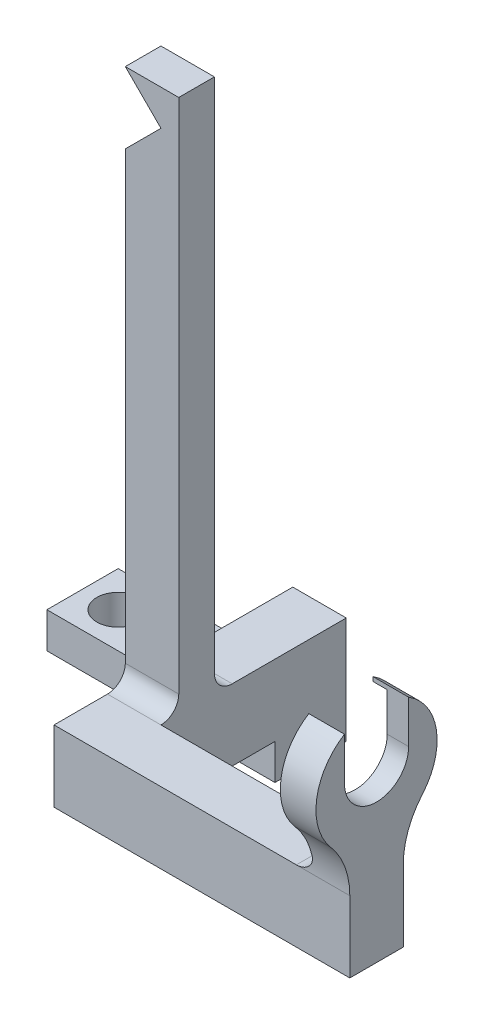
ISO-10303-21;
HEADER;
FILE_DESCRIPTION(('STEP AP214'),'2;1');
FILE_NAME('part.step','',(''),(''),'','','');
FILE_SCHEMA(('AUTOMOTIVE_DESIGN { 1 0 10303 214 1 1 1 1 }'));
ENDSEC;
DATA;
#1=APPLICATION_CONTEXT('core data for automotive mechanical design processes');
#2=APPLICATION_PROTOCOL_DEFINITION('international standard','automotive_design',2000,#1);
#3=PRODUCT_CONTEXT('',#1,'mechanical');
#4=PRODUCT('Part','Part','',(#3));
#5=PRODUCT_RELATED_PRODUCT_CATEGORY('part','',(#4));
#6=PRODUCT_DEFINITION_FORMATION('','',#4);
#7=PRODUCT_DEFINITION_CONTEXT('part definition',#1,'design');
#8=PRODUCT_DEFINITION('design','',#6,#7);
#9=PRODUCT_DEFINITION_SHAPE('','',#8);
#10=(LENGTH_UNIT() NAMED_UNIT(*) SI_UNIT(.MILLI.,.METRE.));
#11=(NAMED_UNIT(*) PLANE_ANGLE_UNIT() SI_UNIT($,.RADIAN.));
#12=(NAMED_UNIT(*) SI_UNIT($,.STERADIAN.) SOLID_ANGLE_UNIT());
#13=UNCERTAINTY_MEASURE_WITH_UNIT(LENGTH_MEASURE(1.E-05),#10,'distance_accuracy_value','');
#14=(GEOMETRIC_REPRESENTATION_CONTEXT(3) GLOBAL_UNCERTAINTY_ASSIGNED_CONTEXT((#13)) GLOBAL_UNIT_ASSIGNED_CONTEXT((#10,
#11,#12)) REPRESENTATION_CONTEXT('',''));
#15=CARTESIAN_POINT('',(0.,0.,0.));
#16=DIRECTION('',(0.,0.,1.));
#17=DIRECTION('',(1.,0.,0.));
#18=AXIS2_PLACEMENT_3D('',#15,#16,#17);
#19=CARTESIAN_POINT('',(0.,5.,0.));
#20=DIRECTION('',(0.,-1.,0.));
#21=DIRECTION('',(0.,0.,-1.));
#22=AXIS2_PLACEMENT_3D('',#19,#20,#21);
#23=PLANE('',#22);
#24=CARTESIAN_POINT('',(0.,5.,0.));
#25=DIRECTION('',(0.,1.,0.));
#26=DIRECTION('',(0.,0.,1.));
#27=AXIS2_PLACEMENT_3D('',#24,#25,#26);
#28=CIRCLE('',#27,3.);
#29=CARTESIAN_POINT('',(0.,5.,3.));
#30=VERTEX_POINT('',#29);
#31=EDGE_CURVE('E489',#30,#30,#28,.T.);
#32=ORIENTED_EDGE('',*,*,#31,.F.);
#33=EDGE_LOOP('',(#32));
#34=FACE_BOUND('',#33,.T.);
#35=DIRECTION('',(0.,0.,-1.));
#36=VECTOR('',#35,1.);
#37=CARTESIAN_POINT('',(15.,5.,5.));
#38=LINE('',#37,#36);
#39=CARTESIAN_POINT('',(15.,5.,0.));
#40=VERTEX_POINT('',#39);
#41=CARTESIAN_POINT('',(15.,5.,-5.));
#42=VERTEX_POINT('',#41);
#43=EDGE_CURVE('E62',#40,#42,#38,.T.);
#44=ORIENTED_EDGE('',*,*,#43,.T.);
#45=DIRECTION('',(-1.,0.,0.));
#46=VECTOR('',#45,1.);
#47=CARTESIAN_POINT('',(-5.,5.,-5.));
#48=LINE('',#47,#46);
#49=CARTESIAN_POINT('',(-5.,5.,-5.));
#50=VERTEX_POINT('',#49);
#51=EDGE_CURVE('E404',#42,#50,#48,.T.);
#52=ORIENTED_EDGE('',*,*,#51,.T.);
#53=DIRECTION('',(0.,0.,1.));
#54=VECTOR('',#53,1.);
#55=CARTESIAN_POINT('',(-5.,5.,5.));
#56=LINE('',#55,#54);
#57=CARTESIAN_POINT('',(-5.,5.,5.));
#58=VERTEX_POINT('',#57);
#59=EDGE_CURVE('E412',#50,#58,#56,.T.);
#60=ORIENTED_EDGE('',*,*,#59,.T.);
#61=DIRECTION('',(1.,0.,0.));
#62=VECTOR('',#61,1.);
#63=CARTESIAN_POINT('',(17.,5.,5.));
#64=LINE('',#63,#62);
#65=CARTESIAN_POINT('',(15.,5.,5.));
#66=VERTEX_POINT('',#65);
#67=EDGE_CURVE('E55',#58,#66,#64,.T.);
#68=ORIENTED_EDGE('',*,*,#67,.T.);
#69=EDGE_CURVE('E270',#66,#40,#38,.T.);
#70=ORIENTED_EDGE('',*,*,#69,.T.);
#71=CARTESIAN_POINT('',(12.,5.,0.));
#72=DIRECTION('',(0.,1.,0.));
#73=DIRECTION('',(0.,0.,1.));
#74=AXIS2_PLACEMENT_3D('',#71,#72,#73);
#75=CIRCLE('',#74,3.);
#76=EDGE_CURVE('E482',#40,#40,#75,.T.);
#77=ORIENTED_EDGE('',*,*,#76,.F.);
#78=EDGE_LOOP('',(#44,#52,#60,#68,#70,#77));
#79=FACE_BOUND('',#78,.T.);
#80=ADVANCED_FACE('F39',(#34,#79),#23,.F.);
#81=CARTESIAN_POINT('',(19.5,15.,18.5));
#82=DIRECTION('',(0.,0.,-1.));
#83=DIRECTION('',(-1.,0.,0.));
#84=AXIS2_PLACEMENT_3D('',#81,#82,#83);
#85=PLANE('',#84);
#86=DIRECTION('',(1.,0.,0.));
#87=VECTOR('',#86,1.);
#88=CARTESIAN_POINT('',(15.9644660940672,17.5,18.5));
#89=LINE('',#88,#87);
#90=CARTESIAN_POINT('',(19.5,17.5,18.5));
#91=VERTEX_POINT('',#90);
#92=CARTESIAN_POINT('',(27.,17.5,18.5));
#93=VERTEX_POINT('',#92);
#94=EDGE_CURVE('E258',#91,#93,#89,.T.);
#95=ORIENTED_EDGE('',*,*,#94,.T.);
#96=DIRECTION('',(0.,-1.,0.));
#97=VECTOR('',#96,1.);
#98=CARTESIAN_POINT('',(27.,15.,18.5));
#99=LINE('',#98,#97);
#100=CARTESIAN_POINT('',(27.,90.,18.5));
#101=VERTEX_POINT('',#100);
#102=EDGE_CURVE('E461',#101,#93,#99,.T.);
#103=ORIENTED_EDGE('',*,*,#102,.F.);
#104=DIRECTION('',(1.,0.,0.));
#105=VECTOR('',#104,1.);
#106=CARTESIAN_POINT('',(19.5,90.,18.5));
#107=LINE('',#106,#105);
#108=CARTESIAN_POINT('',(19.5,90.,18.5));
#109=VERTEX_POINT('',#108);
#110=EDGE_CURVE('E658',#109,#101,#107,.T.);
#111=ORIENTED_EDGE('',*,*,#110,.F.);
#112=DIRECTION('',(-0.707106781186547,0.707106781186547,0.));
#113=VECTOR('',#112,1.);
#114=CARTESIAN_POINT('',(19.5,90.,18.5));
#115=LINE('',#114,#113);
#116=CARTESIAN_POINT('',(24.5,85.,18.5));
#117=VERTEX_POINT('',#116);
#118=EDGE_CURVE('E646',#117,#109,#115,.T.);
#119=ORIENTED_EDGE('',*,*,#118,.F.);
#120=DIRECTION('',(0.707106781186547,0.707106781186547,0.));
#121=VECTOR('',#120,1.);
#122=CARTESIAN_POINT('',(24.5,85.,18.5));
#123=LINE('',#122,#121);
#124=CARTESIAN_POINT('',(19.5,80.,18.5));
#125=VERTEX_POINT('',#124);
#126=EDGE_CURVE('E642',#125,#117,#123,.T.);
#127=ORIENTED_EDGE('',*,*,#126,.F.);
#128=DIRECTION('',(0.,-1.,0.));
#129=VECTOR('',#128,1.);
#130=CARTESIAN_POINT('',(19.5,15.,18.5));
#131=LINE('',#130,#129);
#132=EDGE_CURVE('E465',#125,#91,#131,.T.);
#133=ORIENTED_EDGE('',*,*,#132,.T.);
#134=EDGE_LOOP('',(#95,#103,#111,#119,#127,#133));
#135=FACE_BOUND('',#134,.T.);
#136=ADVANCED_FACE('F336',(#135),#85,.F.);
#137=CARTESIAN_POINT('',(0.,15.,0.));
#138=DIRECTION('',(0.,1.,0.));
#139=DIRECTION('',(0.,0.,1.));
#140=AXIS2_PLACEMENT_3D('',#137,#138,#139);
#141=PLANE('',#140);
#142=DIRECTION('',(-1.,0.,0.));
#143=VECTOR('',#142,1.);
#144=CARTESIAN_POINT('',(56.,15.,21.));
#145=LINE('',#144,#143);
#146=CARTESIAN_POINT('',(53.5,15.,21.));
#147=VERTEX_POINT('',#146);
#148=CARTESIAN_POINT('',(27.,15.,21.));
#149=VERTEX_POINT('',#148);
#150=EDGE_CURVE('E252',#147,#149,#145,.T.);
#151=ORIENTED_EDGE('',*,*,#150,.T.);
#152=DIRECTION('',(1.,0.,0.));
#153=VECTOR('',#152,1.);
#154=CARTESIAN_POINT('',(15.9644660940672,15.,21.));
#155=LINE('',#154,#153);
#156=CARTESIAN_POINT('',(19.5,15.,21.));
#157=VERTEX_POINT('',#156);
#158=EDGE_CURVE('E248',#157,#149,#155,.T.);
#159=ORIENTED_EDGE('',*,*,#158,.F.);
#160=DIRECTION('',(0.,0.,1.));
#161=VECTOR('',#160,1.);
#162=CARTESIAN_POINT('',(19.5,15.,-5.));
#163=LINE('',#162,#161);
#164=CARTESIAN_POINT('',(19.5,15.,28.5));
#165=VERTEX_POINT('',#164);
#166=EDGE_CURVE('E231',#157,#165,#163,.T.);
#167=ORIENTED_EDGE('',*,*,#166,.T.);
#168=DIRECTION('',(1.,0.,0.));
#169=VECTOR('',#168,1.);
#170=CARTESIAN_POINT('',(19.5,15.,28.5));
#171=LINE('',#170,#169);
#172=CARTESIAN_POINT('',(53.5,15.,28.5));
#173=VERTEX_POINT('',#172);
#174=EDGE_CURVE('E244',#165,#173,#171,.T.);
#175=ORIENTED_EDGE('',*,*,#174,.T.);
#176=DIRECTION('',(0.,0.,1.));
#177=VECTOR('',#176,1.);
#178=CARTESIAN_POINT('',(53.5,15.,-5.001));
#179=LINE('',#178,#177);
#180=EDGE_CURVE('E296',#147,#173,#179,.T.);
#181=ORIENTED_EDGE('',*,*,#180,.F.);
#182=EDGE_LOOP('',(#151,#159,#167,#175,#181));
#183=FACE_BOUND('',#182,.T.);
#184=ADVANCED_FACE('F249',(#183),#141,.T.);
#185=CARTESIAN_POINT('',(0.,15.,0.));
#186=DIRECTION('',(0.,-1.,0.));
#187=DIRECTION('',(0.,0.,-1.));
#188=AXIS2_PLACEMENT_3D('',#185,#186,#187);
#189=PLANE('',#188);
#190=DIRECTION('',(1.,0.,0.));
#191=VECTOR('',#190,1.);
#192=CARTESIAN_POINT('',(15.9644660940672,15.,11.));
#193=LINE('',#192,#191);
#194=CARTESIAN_POINT('',(19.5,15.,11.));
#195=VERTEX_POINT('',#194);
#196=CARTESIAN_POINT('',(27.,15.,11.));
#197=VERTEX_POINT('',#196);
#198=EDGE_CURVE('E266',#195,#197,#193,.T.);
#199=ORIENTED_EDGE('',*,*,#198,.T.);
#200=DIRECTION('',(0.,0.,-1.));
#201=VECTOR('',#200,1.);
#202=CARTESIAN_POINT('',(27.,15.,7.5));
#203=LINE('',#202,#201);
#204=CARTESIAN_POINT('',(27.,15.,-5.));
#205=VERTEX_POINT('',#204);
#206=EDGE_CURVE('E458',#197,#205,#203,.T.);
#207=ORIENTED_EDGE('',*,*,#206,.T.);
#208=DIRECTION('',(-1.,0.,0.));
#209=VECTOR('',#208,1.);
#210=CARTESIAN_POINT('',(19.5,15.,-5.));
#211=LINE('',#210,#209);
#212=CARTESIAN_POINT('',(19.5,15.,-5.));
#213=VERTEX_POINT('',#212);
#214=EDGE_CURVE('E452',#205,#213,#211,.T.);
#215=ORIENTED_EDGE('',*,*,#214,.T.);
#216=DIRECTION('',(0.,0.,1.));
#217=VECTOR('',#216,1.);
#218=CARTESIAN_POINT('',(19.5,15.,7.5));
#219=LINE('',#218,#217);
#220=EDGE_CURVE('E678',#213,#195,#219,.T.);
#221=ORIENTED_EDGE('',*,*,#220,.T.);
#222=EDGE_LOOP('',(#199,#207,#215,#221));
#223=FACE_BOUND('',#222,.T.);
#224=ADVANCED_FACE('F335',(#223),#189,.F.);
#225=CARTESIAN_POINT('',(56.,15.,9.90858968811784));
#226=DIRECTION('',(-1.,0.,0.));
#227=DIRECTION('',(0.,0.,1.));
#228=AXIS2_PLACEMENT_3D('',#225,#226,#227);
#229=PLANE('',#228);
#230=CARTESIAN_POINT('',(56.,15.,9.90858968811784));
#231=DIRECTION('',(-1.,0.,0.));
#232=DIRECTION('',(0.,0.,1.));
#233=AXIS2_PLACEMENT_3D('',#230,#231,#232);
#234=CIRCLE('',#233,11.0914103118822);
#235=CARTESIAN_POINT('',(56.,17.5,20.7145779680729));
#236=VERTEX_POINT('',#235);
#237=CARTESIAN_POINT('',(56.,22.2402602357938,18.3108521467958));
#238=VERTEX_POINT('',#237);
#239=EDGE_CURVE('E564',#236,#238,#234,.T.);
#240=ORIENTED_EDGE('',*,*,#239,.F.);
#241=DIRECTION('',(0.,0.,1.));
#242=VECTOR('',#241,1.);
#243=CARTESIAN_POINT('',(56.,17.5,-5.001));
#244=LINE('',#243,#242);
#245=CARTESIAN_POINT('',(56.,17.5,28.7854220319271));
#246=VERTEX_POINT('',#245);
#247=EDGE_CURVE('E713',#236,#246,#244,.T.);
#248=ORIENTED_EDGE('',*,*,#247,.T.);
#249=CARTESIAN_POINT('',(56.,15.,39.5914103118822));
#250=DIRECTION('',(-1.,0.,0.));
#251=DIRECTION('',(0.,0.,-1.));
#252=AXIS2_PLACEMENT_3D('',#249,#250,#251);
#253=CIRCLE('',#252,11.0914103118822);
#254=CARTESIAN_POINT('',(56.,22.2402602357938,31.1891478532042));
#255=VERTEX_POINT('',#254);
#256=EDGE_CURVE('E576',#255,#246,#253,.T.);
#257=ORIENTED_EDGE('',*,*,#256,.F.);
#258=CARTESIAN_POINT('',(56.,27.788897449072,24.75));
#259=DIRECTION('',(1.,0.,0.));
#260=DIRECTION('',(0.,0.,-1.));
#261=AXIS2_PLACEMENT_3D('',#258,#259,#260);
#262=CIRCLE('',#261,8.5);
#263=CARTESIAN_POINT('',(56.,35.,29.25));
#264=VERTEX_POINT('',#263);
#265=EDGE_CURVE('E572',#264,#255,#262,.T.);
#266=ORIENTED_EDGE('',*,*,#265,.F.);
#267=DIRECTION('',(0.,-1.,0.));
#268=VECTOR('',#267,1.);
#269=CARTESIAN_POINT('',(56.,35.,29.25));
#270=LINE('',#269,#268);
#271=CARTESIAN_POINT('',(56.,34.4032757267335,29.25));
#272=VERTEX_POINT('',#271);
#273=EDGE_CURVE('E558',#264,#272,#270,.T.);
#274=ORIENTED_EDGE('',*,*,#273,.T.);
#275=CARTESIAN_POINT('',(56.,27.788897449072,24.75));
#276=DIRECTION('',(1.,0.,0.));
#277=DIRECTION('',(0.,0.,-1.));
#278=AXIS2_PLACEMENT_3D('',#275,#276,#277);
#279=CIRCLE('',#278,8.);
#280=CARTESIAN_POINT('',(56.,34.4032757267335,20.25));
#281=VERTEX_POINT('',#280);
#282=EDGE_CURVE('E538',#272,#281,#279,.T.);
#283=ORIENTED_EDGE('',*,*,#282,.T.);
#284=DIRECTION('',(0.,1.,0.));
#285=VECTOR('',#284,1.);
#286=CARTESIAN_POINT('',(56.,35.,20.25));
#287=LINE('',#286,#285);
#288=CARTESIAN_POINT('',(56.,35.,20.25));
#289=VERTEX_POINT('',#288);
#290=EDGE_CURVE('E544',#281,#289,#287,.T.);
#291=ORIENTED_EDGE('',*,*,#290,.T.);
#292=CARTESIAN_POINT('',(56.,27.788897449072,24.75));
#293=DIRECTION('',(1.,0.,0.));
#294=DIRECTION('',(0.,0.,-1.));
#295=AXIS2_PLACEMENT_3D('',#292,#293,#294);
#296=CIRCLE('',#295,8.5);
#297=EDGE_CURVE('E567',#238,#289,#296,.T.);
#298=ORIENTED_EDGE('',*,*,#297,.F.);
#299=EDGE_LOOP('',(#240,#248,#257,#266,#274,#283,#291,#298));
#300=FACE_BOUND('',#299,.T.);
#301=ADVANCED_FACE('F315',(#300),#229,.T.);
#302=CARTESIAN_POINT('',(-5.00099999999999,35.,20.25));
#303=DIRECTION('',(0.,0.,-1.));
#304=DIRECTION('',(-1.,0.,0.));
#305=AXIS2_PLACEMENT_3D('',#302,#303,#304);
#306=PLANE('',#305);
#307=DIRECTION('',(-1.,0.,0.));
#308=VECTOR('',#307,1.);
#309=CARTESIAN_POINT('',(58.,34.4032757267335,20.25));
#310=LINE('',#309,#308);
#311=CARTESIAN_POINT('',(58.,34.4032757267335,20.25));
#312=VERTEX_POINT('',#311);
#313=EDGE_CURVE('E536',#312,#281,#310,.T.);
#314=ORIENTED_EDGE('',*,*,#313,.F.);
#315=DIRECTION('',(0.,-1.,0.));
#316=VECTOR('',#315,1.);
#317=CARTESIAN_POINT('',(58.,35.,20.25));
#318=LINE('',#317,#316);
#319=CARTESIAN_POINT('',(58.,29.,20.25));
#320=VERTEX_POINT('',#319);
#321=EDGE_CURVE('E532',#312,#320,#318,.T.);
#322=ORIENTED_EDGE('',*,*,#321,.T.);
#323=DIRECTION('',(1.,0.,0.));
#324=VECTOR('',#323,1.);
#325=CARTESIAN_POINT('',(-5.00099999999999,29.,20.25));
#326=LINE('',#325,#324);
#327=CARTESIAN_POINT('',(61.,29.,20.25));
#328=VERTEX_POINT('',#327);
#329=EDGE_CURVE('E530',#320,#328,#326,.T.);
#330=ORIENTED_EDGE('',*,*,#329,.T.);
#331=DIRECTION('',(0.,1.,0.));
#332=VECTOR('',#331,1.);
#333=CARTESIAN_POINT('',(61.,35.,20.25));
#334=LINE('',#333,#332);
#335=CARTESIAN_POINT('',(61.,35.,20.25));
#336=VERTEX_POINT('',#335);
#337=EDGE_CURVE('E553',#328,#336,#334,.T.);
#338=ORIENTED_EDGE('',*,*,#337,.T.);
#339=DIRECTION('',(1.,0.,0.));
#340=VECTOR('',#339,1.);
#341=CARTESIAN_POINT('',(56.,35.,20.25));
#342=LINE('',#341,#340);
#343=EDGE_CURVE('E606',#289,#336,#342,.T.);
#344=ORIENTED_EDGE('',*,*,#343,.F.);
#345=ORIENTED_EDGE('',*,*,#290,.F.);
#346=EDGE_LOOP('',(#314,#322,#330,#338,#344,#345));
#347=FACE_BOUND('',#346,.T.);
#348=ADVANCED_FACE('F728',(#347),#306,.F.);
#349=CARTESIAN_POINT('',(-5.00099999999999,35.,29.25));
#350=DIRECTION('',(0.,0.,1.));
#351=DIRECTION('',(1.,0.,0.));
#352=AXIS2_PLACEMENT_3D('',#349,#350,#351);
#353=PLANE('',#352);
#354=DIRECTION('',(-1.,0.,0.));
#355=VECTOR('',#354,1.);
#356=CARTESIAN_POINT('',(58.,34.4032757267335,29.25));
#357=LINE('',#356,#355);
#358=CARTESIAN_POINT('',(58.,34.4032757267335,29.25));
#359=VERTEX_POINT('',#358);
#360=EDGE_CURVE('E11',#272,#359,#357,.F.);
#361=ORIENTED_EDGE('',*,*,#360,.F.);
#362=ORIENTED_EDGE('',*,*,#273,.F.);
#363=DIRECTION('',(1.,0.,0.));
#364=VECTOR('',#363,1.);
#365=CARTESIAN_POINT('',(56.,35.,29.25));
#366=LINE('',#365,#364);
#367=CARTESIAN_POINT('',(61.,35.,29.25));
#368=VERTEX_POINT('',#367);
#369=EDGE_CURVE('E603',#264,#368,#366,.T.);
#370=ORIENTED_EDGE('',*,*,#369,.T.);
#371=DIRECTION('',(0.,-1.,0.));
#372=VECTOR('',#371,1.);
#373=CARTESIAN_POINT('',(61.,35.,29.25));
#374=LINE('',#373,#372);
#375=CARTESIAN_POINT('',(61.,29.,29.25));
#376=VERTEX_POINT('',#375);
#377=EDGE_CURVE('E547',#368,#376,#374,.T.);
#378=ORIENTED_EDGE('',*,*,#377,.T.);
#379=DIRECTION('',(1.,0.,0.));
#380=VECTOR('',#379,1.);
#381=CARTESIAN_POINT('',(-5.00099999999999,29.,29.25));
#382=LINE('',#381,#380);
#383=CARTESIAN_POINT('',(58.,29.,29.25));
#384=VERTEX_POINT('',#383);
#385=EDGE_CURVE('E519',#384,#376,#382,.T.);
#386=ORIENTED_EDGE('',*,*,#385,.F.);
#387=DIRECTION('',(0.,1.,0.));
#388=VECTOR('',#387,1.);
#389=CARTESIAN_POINT('',(58.,35.,29.25));
#390=LINE('',#389,#388);
#391=EDGE_CURVE('E48',#384,#359,#390,.T.);
#392=ORIENTED_EDGE('',*,*,#391,.T.);
#393=EDGE_LOOP('',(#361,#362,#370,#378,#386,#392));
#394=FACE_BOUND('',#393,.T.);
#395=ADVANCED_FACE('F391',(#394),#353,.F.);
#396=CARTESIAN_POINT('',(0.,0.,0.));
#397=DIRECTION('',(0.,-1.,0.));
#398=DIRECTION('',(0.,0.,-1.));
#399=AXIS2_PLACEMENT_3D('',#396,#397,#398);
#400=PLANE('',#399);
#401=CARTESIAN_POINT('',(0.,0.,0.));
#402=DIRECTION('',(0.,1.,0.));
#403=DIRECTION('',(0.,0.,1.));
#404=AXIS2_PLACEMENT_3D('',#401,#402,#403);
#405=CIRCLE('',#404,3.);
#406=CARTESIAN_POINT('',(0.,0.,3.));
#407=VERTEX_POINT('',#406);
#408=EDGE_CURVE('E485',#407,#407,#405,.T.);
#409=ORIENTED_EDGE('',*,*,#408,.T.);
#410=EDGE_LOOP('',(#409));
#411=FACE_BOUND('',#410,.T.);
#412=DIRECTION('',(1.,0.,0.));
#413=VECTOR('',#412,1.);
#414=CARTESIAN_POINT('',(17.,0.,5.));
#415=LINE('',#414,#413);
#416=CARTESIAN_POINT('',(-5.,0.,5.));
#417=VERTEX_POINT('',#416);
#418=CARTESIAN_POINT('',(27.,0.,5.));
#419=VERTEX_POINT('',#418);
#420=EDGE_CURVE('E493',#417,#419,#415,.T.);
#421=ORIENTED_EDGE('',*,*,#420,.F.);
#422=DIRECTION('',(0.,0.,1.));
#423=VECTOR('',#422,1.);
#424=CARTESIAN_POINT('',(-5.,0.,5.));
#425=LINE('',#424,#423);
#426=CARTESIAN_POINT('',(-5.,0.,-5.));
#427=VERTEX_POINT('',#426);
#428=EDGE_CURVE('E441',#427,#417,#425,.T.);
#429=ORIENTED_EDGE('',*,*,#428,.F.);
#430=DIRECTION('',(-1.,0.,0.));
#431=VECTOR('',#430,1.);
#432=CARTESIAN_POINT('',(-5.,0.,-5.));
#433=LINE('',#432,#431);
#434=CARTESIAN_POINT('',(27.,0.,-5.));
#435=VERTEX_POINT('',#434);
#436=EDGE_CURVE('E503',#435,#427,#433,.T.);
#437=ORIENTED_EDGE('',*,*,#436,.F.);
#438=DIRECTION('',(0.,0.,1.));
#439=VECTOR('',#438,1.);
#440=CARTESIAN_POINT('',(27.,0.,-5.));
#441=LINE('',#440,#439);
#442=EDGE_CURVE('E475',#435,#419,#441,.T.);
#443=ORIENTED_EDGE('',*,*,#442,.T.);
#444=EDGE_LOOP('',(#421,#429,#437,#443));
#445=FACE_BOUND('',#444,.T.);
#446=CARTESIAN_POINT('',(12.,0.,0.));
#447=DIRECTION('',(0.,1.,0.));
#448=DIRECTION('',(0.,0.,1.));
#449=AXIS2_PLACEMENT_3D('',#446,#447,#448);
#450=CIRCLE('',#449,3.);
#451=CARTESIAN_POINT('',(12.,0.,3.));
#452=VERTEX_POINT('',#451);
#453=EDGE_CURVE('E481',#452,#452,#450,.T.);
#454=ORIENTED_EDGE('',*,*,#453,.T.);
#455=EDGE_LOOP('',(#454));
#456=FACE_BOUND('',#455,.T.);
#457=ADVANCED_FACE('F388',(#411,#445,#456),#400,.T.);
#458=CARTESIAN_POINT('',(17.,5.,5.));
#459=DIRECTION('',(0.,0.,-1.));
#460=DIRECTION('',(-1.,0.,0.));
#461=AXIS2_PLACEMENT_3D('',#458,#459,#460);
#462=PLANE('',#461);
#463=ORIENTED_EDGE('',*,*,#420,.T.);
#464=DIRECTION('',(0.,1.,0.));
#465=VECTOR('',#464,1.);
#466=CARTESIAN_POINT('',(27.,5.,5.));
#467=LINE('',#466,#465);
#468=CARTESIAN_POINT('',(27.,5.,5.));
#469=VERTEX_POINT('',#468);
#470=EDGE_CURVE('E438',#419,#469,#467,.T.);
#471=ORIENTED_EDGE('',*,*,#470,.T.);
#472=CARTESIAN_POINT('',(19.5,5.,5.));
#473=VERTEX_POINT('',#472);
#474=EDGE_CURVE('E436',#473,#469,#64,.T.);
#475=ORIENTED_EDGE('',*,*,#474,.F.);
#476=DIRECTION('',(0.,-1.,0.));
#477=VECTOR('',#476,1.);
#478=CARTESIAN_POINT('',(19.5,5.,5.));
#479=LINE('',#478,#477);
#480=CARTESIAN_POINT('',(19.5,9.5,5.));
#481=VERTEX_POINT('',#480);
#482=EDGE_CURVE('E422',#481,#473,#479,.T.);
#483=ORIENTED_EDGE('',*,*,#482,.F.);
#484=CARTESIAN_POINT('',(15.,9.5,5.));
#485=DIRECTION('',(0.,0.,1.));
#486=DIRECTION('',(-1.,0.,0.));
#487=AXIS2_PLACEMENT_3D('',#484,#485,#486);
#488=CIRCLE('',#487,4.5);
#489=EDGE_CURVE('E419',#66,#481,#488,.T.);
#490=ORIENTED_EDGE('',*,*,#489,.F.);
#491=ORIENTED_EDGE('',*,*,#67,.F.);
#492=DIRECTION('',(0.,-1.,0.));
#493=VECTOR('',#492,1.);
#494=CARTESIAN_POINT('',(-5.,5.,5.));
#495=LINE('',#494,#493);
#496=EDGE_CURVE('E500',#58,#417,#495,.T.);
#497=ORIENTED_EDGE('',*,*,#496,.T.);
#498=EDGE_LOOP('',(#463,#471,#475,#483,#490,#491,#497));
#499=FACE_BOUND('',#498,.T.);
#500=ADVANCED_FACE('F41',(#499),#462,.F.);
#501=CARTESIAN_POINT('',(-5.,5.,-5.));
#502=DIRECTION('',(0.,0.,1.));
#503=DIRECTION('',(1.,0.,0.));
#504=AXIS2_PLACEMENT_3D('',#501,#502,#503);
#505=PLANE('',#504);
#506=ORIENTED_EDGE('',*,*,#51,.F.);
#507=CARTESIAN_POINT('',(15.,9.5,-5.));
#508=DIRECTION('',(0.,0.,1.));
#509=DIRECTION('',(-1.,0.,0.));
#510=AXIS2_PLACEMENT_3D('',#507,#508,#509);
#511=CIRCLE('',#510,4.5);
#512=CARTESIAN_POINT('',(19.5,9.5,-5.));
#513=VERTEX_POINT('',#512);
#514=EDGE_CURVE('E407',#42,#513,#511,.T.);
#515=ORIENTED_EDGE('',*,*,#514,.T.);
#516=DIRECTION('',(0.,-1.,0.));
#517=VECTOR('',#516,1.);
#518=CARTESIAN_POINT('',(19.5,15.,-5.));
#519=LINE('',#518,#517);
#520=EDGE_CURVE('E468',#213,#513,#519,.T.);
#521=ORIENTED_EDGE('',*,*,#520,.F.);
#522=ORIENTED_EDGE('',*,*,#214,.F.);
#523=DIRECTION('',(0.,1.,0.));
#524=VECTOR('',#523,1.);
#525=CARTESIAN_POINT('',(27.,5.,-5.));
#526=LINE('',#525,#524);
#527=EDGE_CURVE('E471',#435,#205,#526,.T.);
#528=ORIENTED_EDGE('',*,*,#527,.F.);
#529=ORIENTED_EDGE('',*,*,#436,.T.);
#530=DIRECTION('',(0.,-1.,0.));
#531=VECTOR('',#530,1.);
#532=CARTESIAN_POINT('',(-5.,5.,-5.));
#533=LINE('',#532,#531);
#534=EDGE_CURVE('E409',#50,#427,#533,.T.);
#535=ORIENTED_EDGE('',*,*,#534,.F.);
#536=EDGE_LOOP('',(#506,#515,#521,#522,#528,#529,#535));
#537=FACE_BOUND('',#536,.T.);
#538=ADVANCED_FACE('F394',(#537),#505,.F.);
#539=CARTESIAN_POINT('',(-5.,5.,5.));
#540=DIRECTION('',(1.,0.,0.));
#541=DIRECTION('',(0.,0.,-1.));
#542=AXIS2_PLACEMENT_3D('',#539,#540,#541);
#543=PLANE('',#542);
#544=ORIENTED_EDGE('',*,*,#428,.T.);
#545=ORIENTED_EDGE('',*,*,#496,.F.);
#546=ORIENTED_EDGE('',*,*,#59,.F.);
#547=ORIENTED_EDGE('',*,*,#534,.T.);
#548=EDGE_LOOP('',(#544,#545,#546,#547));
#549=FACE_BOUND('',#548,.T.);
#550=ADVANCED_FACE('F383',(#549),#543,.F.);
#551=CARTESIAN_POINT('',(0.,5.,0.));
#552=DIRECTION('',(0.,-1.,0.));
#553=DIRECTION('',(0.,0.,-1.));
#554=AXIS2_PLACEMENT_3D('',#551,#552,#553);
#555=CYLINDRICAL_SURFACE('',#554,3.);
#556=ORIENTED_EDGE('',*,*,#31,.T.);
#557=EDGE_LOOP('',(#556));
#558=FACE_BOUND('',#557,.T.);
#559=ORIENTED_EDGE('',*,*,#408,.F.);
#560=EDGE_LOOP('',(#559));
#561=FACE_BOUND('',#560,.T.);
#562=ADVANCED_FACE('F379',(#558,#561),#555,.F.);
#563=CARTESIAN_POINT('',(12.,5.,0.));
#564=DIRECTION('',(0.,-1.,0.));
#565=DIRECTION('',(0.,0.,-1.));
#566=AXIS2_PLACEMENT_3D('',#563,#564,#565);
#567=CYLINDRICAL_SURFACE('',#566,3.);
#568=ORIENTED_EDGE('',*,*,#76,.T.);
#569=EDGE_LOOP('',(#568));
#570=FACE_BOUND('',#569,.T.);
#571=ORIENTED_EDGE('',*,*,#453,.F.);
#572=EDGE_LOOP('',(#571));
#573=FACE_BOUND('',#572,.T.);
#574=ADVANCED_FACE('F375',(#570,#573),#567,.F.);
#575=CARTESIAN_POINT('',(27.,5.,-5.));
#576=DIRECTION('',(1.,0.,0.));
#577=DIRECTION('',(0.,0.,-1.));
#578=AXIS2_PLACEMENT_3D('',#575,#576,#577);
#579=PLANE('',#578);
#580=ORIENTED_EDGE('',*,*,#102,.T.);
#581=CARTESIAN_POINT('',(27.,17.5,21.));
#582=DIRECTION('',(-1.,0.,0.));
#583=DIRECTION('',(0.,0.,1.));
#584=AXIS2_PLACEMENT_3D('',#581,#582,#583);
#585=CIRCLE('',#584,2.50000000000002);
#586=EDGE_CURVE('E272',#93,#149,#585,.T.);
#587=ORIENTED_EDGE('',*,*,#586,.T.);
#588=DIRECTION('',(0.,1.,0.));
#589=VECTOR('',#588,1.);
#590=CARTESIAN_POINT('',(27.,5.,21.));
#591=LINE('',#590,#589);
#592=CARTESIAN_POINT('',(27.,5.,21.));
#593=VERTEX_POINT('',#592);
#594=EDGE_CURVE('E633',#593,#149,#591,.T.);
#595=ORIENTED_EDGE('',*,*,#594,.F.);
#596=DIRECTION('',(0.,0.,-1.));
#597=VECTOR('',#596,1.);
#598=CARTESIAN_POINT('',(27.,5.,-5.));
#599=LINE('',#598,#597);
#600=EDGE_CURVE('E447',#593,#469,#599,.T.);
#601=ORIENTED_EDGE('',*,*,#600,.T.);
#602=ORIENTED_EDGE('',*,*,#470,.F.);
#603=ORIENTED_EDGE('',*,*,#442,.F.);
#604=ORIENTED_EDGE('',*,*,#527,.T.);
#605=ORIENTED_EDGE('',*,*,#206,.F.);
#606=CARTESIAN_POINT('',(27.,17.5,11.));
#607=DIRECTION('',(-1.,0.,0.));
#608=DIRECTION('',(0.,0.,-1.));
#609=AXIS2_PLACEMENT_3D('',#606,#607,#608);
#610=CIRCLE('',#609,2.50000000000001);
#611=CARTESIAN_POINT('',(27.,17.5,13.5));
#612=VERTEX_POINT('',#611);
#613=EDGE_CURVE('E262',#197,#612,#610,.T.);
#614=ORIENTED_EDGE('',*,*,#613,.T.);
#615=DIRECTION('',(0.,-1.,0.));
#616=VECTOR('',#615,1.);
#617=CARTESIAN_POINT('',(27.,90.,13.5));
#618=LINE('',#617,#616);
#619=CARTESIAN_POINT('',(27.,90.,13.5));
#620=VERTEX_POINT('',#619);
#621=EDGE_CURVE('E448',#620,#612,#618,.T.);
#622=ORIENTED_EDGE('',*,*,#621,.F.);
#623=DIRECTION('',(0.,0.,-1.));
#624=VECTOR('',#623,1.);
#625=CARTESIAN_POINT('',(27.,90.,18.5));
#626=LINE('',#625,#624);
#627=EDGE_CURVE('E662',#101,#620,#626,.T.);
#628=ORIENTED_EDGE('',*,*,#627,.F.);
#629=EDGE_LOOP('',(#580,#587,#595,#601,#602,#603,#604,#605,#614,#622,#628));
#630=FACE_BOUND('',#629,.T.);
#631=ADVANCED_FACE('F372',(#630),#579,.T.);
#632=CARTESIAN_POINT('',(19.5,15.,7.5));
#633=DIRECTION('',(1.,0.,0.));
#634=DIRECTION('',(0.,0.,-1.));
#635=AXIS2_PLACEMENT_3D('',#632,#633,#634);
#636=PLANE('',#635);
#637=ORIENTED_EDGE('',*,*,#520,.T.);
#638=DIRECTION('',(0.,0.,-1.));
#639=VECTOR('',#638,1.);
#640=CARTESIAN_POINT('',(19.5,9.5,5.));
#641=LINE('',#640,#639);
#642=EDGE_CURVE('E274',#481,#513,#641,.T.);
#643=ORIENTED_EDGE('',*,*,#642,.F.);
#644=ORIENTED_EDGE('',*,*,#482,.T.);
#645=DIRECTION('',(0.,0.,1.));
#646=VECTOR('',#645,1.);
#647=CARTESIAN_POINT('',(19.5,5.,7.5));
#648=LINE('',#647,#646);
#649=CARTESIAN_POINT('',(19.5,5.,28.5));
#650=VERTEX_POINT('',#649);
#651=EDGE_CURVE('E433',#473,#650,#648,.T.);
#652=ORIENTED_EDGE('',*,*,#651,.T.);
#653=DIRECTION('',(0.,1.,0.));
#654=VECTOR('',#653,1.);
#655=CARTESIAN_POINT('',(19.5,5.,28.5));
#656=LINE('',#655,#654);
#657=EDGE_CURVE('E239',#650,#165,#656,.T.);
#658=ORIENTED_EDGE('',*,*,#657,.T.);
#659=ORIENTED_EDGE('',*,*,#166,.F.);
#660=CARTESIAN_POINT('',(19.5,17.5,21.));
#661=DIRECTION('',(1.,0.,0.));
#662=DIRECTION('',(0.,0.,-1.));
#663=AXIS2_PLACEMENT_3D('',#660,#661,#662);
#664=CIRCLE('',#663,2.50000000000002);
#665=EDGE_CURVE('E236',#157,#91,#664,.T.);
#666=ORIENTED_EDGE('',*,*,#665,.T.);
#667=ORIENTED_EDGE('',*,*,#132,.F.);
#668=DIRECTION('',(0.,0.,1.));
#669=VECTOR('',#668,1.);
#670=CARTESIAN_POINT('',(19.5,80.,-5.001));
#671=LINE('',#670,#669);
#672=CARTESIAN_POINT('',(19.5,80.,13.5));
#673=VERTEX_POINT('',#672);
#674=EDGE_CURVE('E649',#673,#125,#671,.T.);
#675=ORIENTED_EDGE('',*,*,#674,.F.);
#676=DIRECTION('',(0.,-1.,0.));
#677=VECTOR('',#676,1.);
#678=CARTESIAN_POINT('',(19.5,90.,13.5));
#679=LINE('',#678,#677);
#680=CARTESIAN_POINT('',(19.5,17.5,13.5));
#681=VERTEX_POINT('',#680);
#682=EDGE_CURVE('E455',#673,#681,#679,.T.);
#683=ORIENTED_EDGE('',*,*,#682,.T.);
#684=CARTESIAN_POINT('',(19.5,17.5,11.));
#685=DIRECTION('',(1.,0.,0.));
#686=DIRECTION('',(0.,0.,-1.));
#687=AXIS2_PLACEMENT_3D('',#684,#685,#686);
#688=CIRCLE('',#687,2.50000000000001);
#689=EDGE_CURVE('E281',#681,#195,#688,.T.);
#690=ORIENTED_EDGE('',*,*,#689,.T.);
#691=ORIENTED_EDGE('',*,*,#220,.F.);
#692=EDGE_LOOP('',(#637,#643,#644,#652,#658,#659,#666,#667,#675,#683,#690,#691));
#693=FACE_BOUND('',#692,.T.);
#694=ADVANCED_FACE('F233',(#693),#636,.F.);
#695=CARTESIAN_POINT('',(0.,5.,0.));
#696=DIRECTION('',(0.,-1.,0.));
#697=DIRECTION('',(0.,0.,-1.));
#698=AXIS2_PLACEMENT_3D('',#695,#696,#697);
#699=PLANE('',#698);
#700=ORIENTED_EDGE('',*,*,#651,.F.);
#701=ORIENTED_EDGE('',*,*,#474,.T.);
#702=ORIENTED_EDGE('',*,*,#600,.F.);
#703=DIRECTION('',(-1.,0.,0.));
#704=VECTOR('',#703,1.);
#705=CARTESIAN_POINT('',(56.,5.,21.));
#706=LINE('',#705,#704);
#707=CARTESIAN_POINT('',(61.,5.,21.));
#708=VERTEX_POINT('',#707);
#709=EDGE_CURVE('E624',#708,#593,#706,.T.);
#710=ORIENTED_EDGE('',*,*,#709,.F.);
#711=DIRECTION('',(0.,0.,-1.));
#712=VECTOR('',#711,1.);
#713=CARTESIAN_POINT('',(61.,5.,28.5));
#714=LINE('',#713,#712);
#715=CARTESIAN_POINT('',(61.,5.,28.5));
#716=VERTEX_POINT('',#715);
#717=EDGE_CURVE('E245',#716,#708,#714,.T.);
#718=ORIENTED_EDGE('',*,*,#717,.F.);
#719=DIRECTION('',(1.,0.,0.));
#720=VECTOR('',#719,1.);
#721=CARTESIAN_POINT('',(19.5,5.,28.5));
#722=LINE('',#721,#720);
#723=EDGE_CURVE('E445',#650,#716,#722,.T.);
#724=ORIENTED_EDGE('',*,*,#723,.F.);
#725=EDGE_LOOP('',(#700,#701,#702,#710,#718,#724));
#726=FACE_BOUND('',#725,.T.);
#727=ADVANCED_FACE('F359',(#726),#699,.T.);
#728=CARTESIAN_POINT('',(27.,90.,13.5));
#729=DIRECTION('',(0.,0.,1.));
#730=DIRECTION('',(1.,0.,0.));
#731=AXIS2_PLACEMENT_3D('',#728,#729,#730);
#732=PLANE('',#731);
#733=ORIENTED_EDGE('',*,*,#621,.T.);
#734=DIRECTION('',(1.,0.,0.));
#735=VECTOR('',#734,1.);
#736=CARTESIAN_POINT('',(15.9644660940672,17.5,13.5));
#737=LINE('',#736,#735);
#738=EDGE_CURVE('E278',#681,#612,#737,.T.);
#739=ORIENTED_EDGE('',*,*,#738,.F.);
#740=ORIENTED_EDGE('',*,*,#682,.F.);
#741=DIRECTION('',(-0.707106781186548,-0.707106781186548,0.));
#742=VECTOR('',#741,1.);
#743=CARTESIAN_POINT('',(24.5,85.,13.5));
#744=LINE('',#743,#742);
#745=CARTESIAN_POINT('',(24.5,85.,13.5));
#746=VERTEX_POINT('',#745);
#747=EDGE_CURVE('E653',#746,#673,#744,.T.);
#748=ORIENTED_EDGE('',*,*,#747,.F.);
#749=DIRECTION('',(0.707106781186548,-0.707106781186548,0.));
#750=VECTOR('',#749,1.);
#751=CARTESIAN_POINT('',(19.5,90.,13.5));
#752=LINE('',#751,#750);
#753=CARTESIAN_POINT('',(19.5,90.,13.5));
#754=VERTEX_POINT('',#753);
#755=EDGE_CURVE('E636',#754,#746,#752,.T.);
#756=ORIENTED_EDGE('',*,*,#755,.F.);
#757=DIRECTION('',(-1.,0.,0.));
#758=VECTOR('',#757,1.);
#759=CARTESIAN_POINT('',(27.,90.,13.5));
#760=LINE('',#759,#758);
#761=EDGE_CURVE('E665',#620,#754,#760,.T.);
#762=ORIENTED_EDGE('',*,*,#761,.F.);
#763=EDGE_LOOP('',(#733,#739,#740,#748,#756,#762));
#764=FACE_BOUND('',#763,.T.);
#765=ADVANCED_FACE('F355',(#764),#732,.F.);
#766=CARTESIAN_POINT('',(0.,90.,0.));
#767=DIRECTION('',(0.,1.,0.));
#768=DIRECTION('',(0.,0.,1.));
#769=AXIS2_PLACEMENT_3D('',#766,#767,#768);
#770=PLANE('',#769);
#771=ORIENTED_EDGE('',*,*,#110,.T.);
#772=ORIENTED_EDGE('',*,*,#627,.T.);
#773=ORIENTED_EDGE('',*,*,#761,.T.);
#774=DIRECTION('',(0.,0.,1.));
#775=VECTOR('',#774,1.);
#776=CARTESIAN_POINT('',(19.5,90.,13.5));
#777=LINE('',#776,#775);
#778=EDGE_CURVE('E669',#754,#109,#777,.T.);
#779=ORIENTED_EDGE('',*,*,#778,.T.);
#780=EDGE_LOOP('',(#771,#772,#773,#779));
#781=FACE_BOUND('',#780,.T.);
#782=ADVANCED_FACE('F348',(#781),#770,.T.);
#783=CARTESIAN_POINT('',(19.5,90.,-5.001));
#784=DIRECTION('',(0.707106781186547,0.707106781186547,0.));
#785=DIRECTION('',(-0.707106781186548,0.707106781186548,0.));
#786=AXIS2_PLACEMENT_3D('',#783,#784,#785);
#787=PLANE('',#786);
#788=ORIENTED_EDGE('',*,*,#755,.T.);
#789=DIRECTION('',(0.,0.,1.));
#790=VECTOR('',#789,1.);
#791=CARTESIAN_POINT('',(24.5,85.,-5.001));
#792=LINE('',#791,#790);
#793=EDGE_CURVE('E650',#746,#117,#792,.T.);
#794=ORIENTED_EDGE('',*,*,#793,.T.);
#795=ORIENTED_EDGE('',*,*,#118,.T.);
#796=ORIENTED_EDGE('',*,*,#778,.F.);
#797=EDGE_LOOP('',(#788,#794,#795,#796));
#798=FACE_BOUND('',#797,.T.);
#799=ADVANCED_FACE('F345',(#798),#787,.F.);
#800=CARTESIAN_POINT('',(24.5,85.,-5.001));
#801=DIRECTION('',(0.707106781186547,-0.707106781186547,0.));
#802=DIRECTION('',(0.707106781186548,0.707106781186548,0.));
#803=AXIS2_PLACEMENT_3D('',#800,#801,#802);
#804=PLANE('',#803);
#805=ORIENTED_EDGE('',*,*,#747,.T.);
#806=ORIENTED_EDGE('',*,*,#674,.T.);
#807=ORIENTED_EDGE('',*,*,#126,.T.);
#808=ORIENTED_EDGE('',*,*,#793,.F.);
#809=EDGE_LOOP('',(#805,#806,#807,#808));
#810=FACE_BOUND('',#809,.T.);
#811=ADVANCED_FACE('F340',(#810),#804,.F.);
#812=CARTESIAN_POINT('',(56.,5.,21.));
#813=DIRECTION('',(0.,0.,-1.));
#814=DIRECTION('',(-1.,0.,0.));
#815=AXIS2_PLACEMENT_3D('',#812,#813,#814);
#816=PLANE('',#815);
#817=CARTESIAN_POINT('',(61.,15.,21.));
#818=VERTEX_POINT('',#817);
#819=EDGE_CURVE('E625',#818,#147,#145,.T.);
#820=ORIENTED_EDGE('',*,*,#819,.F.);
#821=DIRECTION('',(0.,-1.,0.));
#822=VECTOR('',#821,1.);
#823=CARTESIAN_POINT('',(61.,15.,21.));
#824=LINE('',#823,#822);
#825=EDGE_CURVE('E599',#818,#708,#824,.T.);
#826=ORIENTED_EDGE('',*,*,#825,.T.);
#827=ORIENTED_EDGE('',*,*,#709,.T.);
#828=ORIENTED_EDGE('',*,*,#594,.T.);
#829=ORIENTED_EDGE('',*,*,#150,.F.);
#830=EDGE_LOOP('',(#820,#826,#827,#828,#829));
#831=FACE_BOUND('',#830,.T.);
#832=ADVANCED_FACE('F337',(#831),#816,.T.);
#833=CARTESIAN_POINT('',(19.5,5.,28.5));
#834=DIRECTION('',(0.,0.,1.));
#835=DIRECTION('',(1.,0.,0.));
#836=AXIS2_PLACEMENT_3D('',#833,#834,#835);
#837=PLANE('',#836);
#838=ORIENTED_EDGE('',*,*,#174,.F.);
#839=ORIENTED_EDGE('',*,*,#657,.F.);
#840=ORIENTED_EDGE('',*,*,#723,.T.);
#841=DIRECTION('',(0.,-1.,0.));
#842=VECTOR('',#841,1.);
#843=CARTESIAN_POINT('',(61.,15.,28.5));
#844=LINE('',#843,#842);
#845=CARTESIAN_POINT('',(61.,15.,28.5));
#846=VERTEX_POINT('',#845);
#847=EDGE_CURVE('E612',#846,#716,#844,.T.);
#848=ORIENTED_EDGE('',*,*,#847,.F.);
#849=DIRECTION('',(1.,0.,0.));
#850=VECTOR('',#849,1.);
#851=CARTESIAN_POINT('',(56.,15.,28.5));
#852=LINE('',#851,#850);
#853=EDGE_CURVE('E595',#173,#846,#852,.T.);
#854=ORIENTED_EDGE('',*,*,#853,.F.);
#855=EDGE_LOOP('',(#838,#839,#840,#848,#854));
#856=FACE_BOUND('',#855,.T.);
#857=ADVANCED_FACE('F331',(#856),#837,.T.);
#858=CARTESIAN_POINT('',(61.,15.,28.5));
#859=DIRECTION('',(1.,0.,0.));
#860=DIRECTION('',(0.,0.,-1.));
#861=AXIS2_PLACEMENT_3D('',#858,#859,#860);
#862=PLANE('',#861);
#863=ORIENTED_EDGE('',*,*,#337,.F.);
#864=CARTESIAN_POINT('',(61.,29.,24.75));
#865=DIRECTION('',(1.,0.,0.));
#866=DIRECTION('',(0.,0.,-1.));
#867=AXIS2_PLACEMENT_3D('',#864,#865,#866);
#868=CIRCLE('',#867,4.5);
#869=EDGE_CURVE('E550',#376,#328,#868,.T.);
#870=ORIENTED_EDGE('',*,*,#869,.F.);
#871=ORIENTED_EDGE('',*,*,#377,.F.);
#872=CARTESIAN_POINT('',(61.,27.788897449072,24.75));
#873=DIRECTION('',(1.,0.,0.));
#874=DIRECTION('',(0.,0.,-1.));
#875=AXIS2_PLACEMENT_3D('',#872,#873,#874);
#876=CIRCLE('',#875,8.5);
#877=CARTESIAN_POINT('',(61.,22.2402602357938,31.1891478532042));
#878=VERTEX_POINT('',#877);
#879=EDGE_CURVE('E588',#368,#878,#876,.T.);
#880=ORIENTED_EDGE('',*,*,#879,.T.);
#881=CARTESIAN_POINT('',(61.,15.,39.5914103118822));
#882=DIRECTION('',(-1.,0.,0.));
#883=DIRECTION('',(0.,0.,-1.));
#884=AXIS2_PLACEMENT_3D('',#881,#882,#883);
#885=CIRCLE('',#884,11.0914103118822);
#886=EDGE_CURVE('E568',#878,#846,#885,.T.);
#887=ORIENTED_EDGE('',*,*,#886,.T.);
#888=ORIENTED_EDGE('',*,*,#847,.T.);
#889=ORIENTED_EDGE('',*,*,#717,.T.);
#890=ORIENTED_EDGE('',*,*,#825,.F.);
#891=CARTESIAN_POINT('',(61.,15.,9.90858968811784));
#892=DIRECTION('',(-1.,0.,0.));
#893=DIRECTION('',(0.,0.,1.));
#894=AXIS2_PLACEMENT_3D('',#891,#892,#893);
#895=CIRCLE('',#894,11.0914103118822);
#896=CARTESIAN_POINT('',(61.,22.2402602357938,18.3108521467958));
#897=VERTEX_POINT('',#896);
#898=EDGE_CURVE('E563',#818,#897,#895,.T.);
#899=ORIENTED_EDGE('',*,*,#898,.T.);
#900=CARTESIAN_POINT('',(61.,27.788897449072,24.75));
#901=DIRECTION('',(1.,0.,0.));
#902=DIRECTION('',(0.,0.,-1.));
#903=AXIS2_PLACEMENT_3D('',#900,#901,#902);
#904=CIRCLE('',#903,8.5);
#905=EDGE_CURVE('E584',#897,#336,#904,.T.);
#906=ORIENTED_EDGE('',*,*,#905,.T.);
#907=EDGE_LOOP('',(#863,#870,#871,#880,#887,#888,#889,#890,#899,#906));
#908=FACE_BOUND('',#907,.T.);
#909=ADVANCED_FACE('F327',(#908),#862,.T.);
#910=CARTESIAN_POINT('',(56.,15.,9.90858968811784));
#911=DIRECTION('',(1.,0.,0.));
#912=DIRECTION('',(0.,0.,-1.));
#913=AXIS2_PLACEMENT_3D('',#910,#911,#912);
#914=CYLINDRICAL_SURFACE('',#913,11.0914103118822);
#915=ORIENTED_EDGE('',*,*,#898,.F.);
#916=ORIENTED_EDGE('',*,*,#819,.T.);
#917=CARTESIAN_POINT('',(53.5,15.,21.));
#918=CARTESIAN_POINT('',(53.5702811992297,14.9999932801543,20.9999950289411));
#919=CARTESIAN_POINT('',(53.6405592027467,15.0029636457825,20.9999998703407));
#920=CARTESIAN_POINT('',(53.7806130312999,15.014806537153,20.9999930121835));
#921=CARTESIAN_POINT('',(53.8503888792018,15.0236787924105,20.9999813133848));
#922=CARTESIAN_POINT('',(53.9889029233826,15.0472655908869,20.9999052405145));
#923=CARTESIAN_POINT('',(54.057641780843,15.061976232669,20.9998409015886));
#924=CARTESIAN_POINT('',(54.1936196346702,15.0971204559773,20.9995885650103));
#925=CARTESIAN_POINT('',(54.2608586493936,15.1175539674193,20.9994005688721));
#926=CARTESIAN_POINT('',(54.4596810974195,15.1872750899866,20.9985178889783));
#927=CARTESIAN_POINT('',(54.5884223742248,15.2449922665516,20.9975046116413));
#928=CARTESIAN_POINT('',(54.8342822520371,15.3811647681495,20.9936563241857));
#929=CARTESIAN_POINT('',(54.9514028125995,15.4596165885795,20.9908216218116));
#930=CARTESIAN_POINT('',(55.1705451424745,15.63481800932,20.9821638525638));
#931=CARTESIAN_POINT('',(55.2725985003893,15.7315283310621,20.9763471554527));
#932=CARTESIAN_POINT('',(55.458948843524,15.9404761130268,20.9605503918202));
#933=CARTESIAN_POINT('',(55.5432461044799,16.0527133320859,20.9505703899581));
#934=CARTESIAN_POINT('',(55.6910705768375,16.2882335267739,20.9255640826013));
#935=CARTESIAN_POINT('',(55.7547714141614,16.4114123755617,20.9105822479636));
#936=CARTESIAN_POINT('',(55.8607710999816,16.6658896993874,20.87493213251));
#937=CARTESIAN_POINT('',(55.9030750528752,16.7971862294922,20.8542652097351));
#938=CARTESIAN_POINT('',(55.9562289060158,17.0243439238312,20.8141162641975));
#939=CARTESIAN_POINT('',(55.9726815291215,17.1191980088724,20.7960922442052));
#940=CARTESIAN_POINT('',(55.9945682465006,17.3094617812013,20.7573357265835));
#941=CARTESIAN_POINT('',(56.0000201427885,17.4048703198579,20.736607662773));
#942=CARTESIAN_POINT('',(56.,17.5,20.7145779680729));
#943=B_SPLINE_CURVE_WITH_KNOTS('',3,(#917,#918,#919,#920,#921,#922,#923,#924,#925,#926,#927,
#928,#929,#930,#931,#932,#933,#934,#935,#936,#937,#938,#939,#940,#941,#942),.UNSPECIFIED.,.F.,
.F.,(4,2,2,2,2,2,2,2,2,2,2,2,4),(0.,0.210775083378146,0.42154050755231,0.632165326574494,
0.842787566327377,1.26387444828794,1.68489020292929,2.10501036070001,2.52512399390678,
2.94159771955824,3.35797204516587,3.65117570991591,3.94390451372082),.UNSPECIFIED.);
#944=EDGE_CURVE('E297',#147,#236,#943,.T.);
#945=ORIENTED_EDGE('',*,*,#944,.T.);
#946=ORIENTED_EDGE('',*,*,#239,.T.);
#947=DIRECTION('',(1.,0.,0.));
#948=VECTOR('',#947,1.);
#949=CARTESIAN_POINT('',(56.,22.2402602357938,18.3108521467958));
#950=LINE('',#949,#948);
#951=EDGE_CURVE('E580',#238,#897,#950,.T.);
#952=ORIENTED_EDGE('',*,*,#951,.T.);
#953=EDGE_LOOP('',(#915,#916,#945,#946,#952));
#954=FACE_BOUND('',#953,.T.);
#955=ADVANCED_FACE('F313',(#954),#914,.F.);
#956=CARTESIAN_POINT('',(56.,15.,39.5914103118822));
#957=DIRECTION('',(1.,0.,0.));
#958=DIRECTION('',(0.,0.,-1.));
#959=AXIS2_PLACEMENT_3D('',#956,#957,#958);
#960=CYLINDRICAL_SURFACE('',#959,11.0914103118822);
#961=ORIENTED_EDGE('',*,*,#886,.F.);
#962=DIRECTION('',(1.,0.,0.));
#963=VECTOR('',#962,1.);
#964=CARTESIAN_POINT('',(56.,22.2402602357938,31.1891478532042));
#965=LINE('',#964,#963);
#966=EDGE_CURVE('E600',#255,#878,#965,.T.);
#967=ORIENTED_EDGE('',*,*,#966,.F.);
#968=ORIENTED_EDGE('',*,*,#256,.T.);
#969=CARTESIAN_POINT('',(53.5,15.,28.5));
#970=CARTESIAN_POINT('',(53.5702811992297,14.9999932801543,28.5000049710589));
#971=CARTESIAN_POINT('',(53.6405592027467,15.0029636457825,28.5000001296593));
#972=CARTESIAN_POINT('',(53.7806130312999,15.014806537153,28.5000069878165));
#973=CARTESIAN_POINT('',(53.8503888792018,15.0236787924105,28.5000186866153));
#974=CARTESIAN_POINT('',(53.9889029233826,15.0472655908869,28.5000947594856));
#975=CARTESIAN_POINT('',(54.057641780843,15.061976232669,28.5001590984114));
#976=CARTESIAN_POINT('',(54.1936196346702,15.0971204559773,28.5004114349897));
#977=CARTESIAN_POINT('',(54.2608586493936,15.1175539674193,28.5005994311279));
#978=CARTESIAN_POINT('',(54.4596810974195,15.1872750899866,28.5014821110217));
#979=CARTESIAN_POINT('',(54.5884223742248,15.2449922665516,28.5024953883587));
#980=CARTESIAN_POINT('',(54.8342822520371,15.3811647681495,28.5063436758143));
#981=CARTESIAN_POINT('',(54.9514028125995,15.4596165885795,28.5091783781885));
#982=CARTESIAN_POINT('',(55.1705451424745,15.63481800932,28.5178361474363));
#983=CARTESIAN_POINT('',(55.2725985003893,15.7315283310621,28.5236528445473));
#984=CARTESIAN_POINT('',(55.458948843524,15.9404761130268,28.5394496081799));
#985=CARTESIAN_POINT('',(55.5432461044799,16.0527133320859,28.5494296100419));
#986=CARTESIAN_POINT('',(55.6910705768375,16.2882335267739,28.5744359173987));
#987=CARTESIAN_POINT('',(55.7547714141614,16.4114123755617,28.5894177520364));
#988=CARTESIAN_POINT('',(55.8607710999816,16.6658896993874,28.6250678674901));
#989=CARTESIAN_POINT('',(55.9030750528752,16.7971862294922,28.645734790265));
#990=CARTESIAN_POINT('',(55.9562289060158,17.0243439238312,28.6858837358026));
#991=CARTESIAN_POINT('',(55.9726815291215,17.1191980088724,28.7039077557949));
#992=CARTESIAN_POINT('',(55.9945682465006,17.3094617812013,28.7426642734165));
#993=CARTESIAN_POINT('',(56.0000201427885,17.4048703198579,28.7633923372271));
#994=CARTESIAN_POINT('',(56.,17.5,28.7854220319271));
#995=B_SPLINE_CURVE_WITH_KNOTS('',3,(#969,#970,#971,#972,#973,#974,#975,#976,#977,#978,#979,
#980,#981,#982,#983,#984,#985,#986,#987,#988,#989,#990,#991,#992,#993,#994),.UNSPECIFIED.,.F.,
.F.,(4,2,2,2,2,2,2,2,2,2,2,2,4),(0.,0.210775083378146,0.421540507552309,0.632165326574494,
0.842787566327377,1.26387444828794,1.68489020292929,2.10501036070001,2.52512399390678,
2.94159771955824,3.35797204516587,3.65117570991591,3.94390451372082),.UNSPECIFIED.);
#996=EDGE_CURVE('E287',#173,#246,#995,.T.);
#997=ORIENTED_EDGE('',*,*,#996,.F.);
#998=ORIENTED_EDGE('',*,*,#853,.T.);
#999=EDGE_LOOP('',(#961,#967,#968,#997,#998));
#1000=FACE_BOUND('',#999,.T.);
#1001=ADVANCED_FACE('F307',(#1000),#960,.F.);
#1002=CARTESIAN_POINT('',(56.,27.788897449072,24.75));
#1003=DIRECTION('',(1.,0.,0.));
#1004=DIRECTION('',(0.,0.,-1.));
#1005=AXIS2_PLACEMENT_3D('',#1002,#1003,#1004);
#1006=CYLINDRICAL_SURFACE('',#1005,8.5);
#1007=ORIENTED_EDGE('',*,*,#879,.F.);
#1008=ORIENTED_EDGE('',*,*,#369,.F.);
#1009=ORIENTED_EDGE('',*,*,#265,.T.);
#1010=ORIENTED_EDGE('',*,*,#966,.T.);
#1011=EDGE_LOOP('',(#1007,#1008,#1009,#1010));
#1012=FACE_BOUND('',#1011,.T.);
#1013=ADVANCED_FACE('F312',(#1012),#1006,.T.);
#1014=CARTESIAN_POINT('',(56.,27.788897449072,24.75));
#1015=DIRECTION('',(1.,0.,0.));
#1016=DIRECTION('',(0.,0.,-1.));
#1017=AXIS2_PLACEMENT_3D('',#1014,#1015,#1016);
#1018=CYLINDRICAL_SURFACE('',#1017,8.5);
#1019=ORIENTED_EDGE('',*,*,#905,.F.);
#1020=ORIENTED_EDGE('',*,*,#951,.F.);
#1021=ORIENTED_EDGE('',*,*,#297,.T.);
#1022=ORIENTED_EDGE('',*,*,#343,.T.);
#1023=EDGE_LOOP('',(#1019,#1020,#1021,#1022));
#1024=FACE_BOUND('',#1023,.T.);
#1025=ADVANCED_FACE('F319',(#1024),#1018,.T.);
#1026=CARTESIAN_POINT('',(-5.00099999999999,29.,24.75));
#1027=DIRECTION('',(1.,0.,0.));
#1028=DIRECTION('',(0.,0.,-1.));
#1029=AXIS2_PLACEMENT_3D('',#1026,#1027,#1028);
#1030=CYLINDRICAL_SURFACE('',#1029,4.5);
#1031=ORIENTED_EDGE('',*,*,#329,.F.);
#1032=CARTESIAN_POINT('',(58.,29.,24.75));
#1033=DIRECTION('',(1.,0.,0.));
#1034=DIRECTION('',(0.,0.,-1.));
#1035=AXIS2_PLACEMENT_3D('',#1032,#1033,#1034);
#1036=CIRCLE('',#1035,4.5);
#1037=EDGE_CURVE('E523',#320,#384,#1036,.F.);
#1038=ORIENTED_EDGE('',*,*,#1037,.T.);
#1039=ORIENTED_EDGE('',*,*,#385,.T.);
#1040=ORIENTED_EDGE('',*,*,#869,.T.);
#1041=EDGE_LOOP('',(#1031,#1038,#1039,#1040));
#1042=FACE_BOUND('',#1041,.T.);
#1043=ADVANCED_FACE('F322',(#1042),#1030,.F.);
#1044=CARTESIAN_POINT('',(58.,27.788897449072,24.75));
#1045=DIRECTION('',(-1.,0.,0.));
#1046=DIRECTION('',(0.,0.,1.));
#1047=AXIS2_PLACEMENT_3D('',#1044,#1045,#1046);
#1048=CYLINDRICAL_SURFACE('',#1047,8.);
#1049=ORIENTED_EDGE('',*,*,#313,.T.);
#1050=ORIENTED_EDGE('',*,*,#282,.F.);
#1051=ORIENTED_EDGE('',*,*,#360,.T.);
#1052=CARTESIAN_POINT('',(58.,27.788897449072,24.75));
#1053=DIRECTION('',(1.,0.,0.));
#1054=DIRECTION('',(0.,0.,-1.));
#1055=AXIS2_PLACEMENT_3D('',#1052,#1053,#1054);
#1056=CIRCLE('',#1055,8.);
#1057=EDGE_CURVE('E526',#359,#312,#1056,.T.);
#1058=ORIENTED_EDGE('',*,*,#1057,.T.);
#1059=EDGE_LOOP('',(#1049,#1050,#1051,#1058));
#1060=FACE_BOUND('',#1059,.T.);
#1061=ADVANCED_FACE('F737',(#1060),#1048,.F.);
#1062=CARTESIAN_POINT('',(58.,27.788897449072,24.75));
#1063=DIRECTION('',(1.,0.,0.));
#1064=DIRECTION('',(0.,0.,-1.));
#1065=AXIS2_PLACEMENT_3D('',#1062,#1063,#1064);
#1066=PLANE('',#1065);
#1067=ORIENTED_EDGE('',*,*,#1057,.F.);
#1068=ORIENTED_EDGE('',*,*,#391,.F.);
#1069=ORIENTED_EDGE('',*,*,#1037,.F.);
#1070=ORIENTED_EDGE('',*,*,#321,.F.);
#1071=EDGE_LOOP('',(#1067,#1068,#1069,#1070));
#1072=FACE_BOUND('',#1071,.T.);
#1073=ADVANCED_FACE('F522',(#1072),#1066,.F.);
#1074=CARTESIAN_POINT('',(53.5,17.5,-5.001));
#1075=DIRECTION('',(0.,0.,1.));
#1076=DIRECTION('',(1.,0.,0.));
#1077=AXIS2_PLACEMENT_3D('',#1074,#1075,#1076);
#1078=CYLINDRICAL_SURFACE('',#1077,2.5);
#1079=ORIENTED_EDGE('',*,*,#944,.F.);
#1080=ORIENTED_EDGE('',*,*,#180,.T.);
#1081=ORIENTED_EDGE('',*,*,#996,.T.);
#1082=ORIENTED_EDGE('',*,*,#247,.F.);
#1083=EDGE_LOOP('',(#1079,#1080,#1081,#1082));
#1084=FACE_BOUND('',#1083,.T.);
#1085=ADVANCED_FACE('F710',(#1084),#1078,.F.);
#1086=CARTESIAN_POINT('',(15.9644660940672,17.5,11.));
#1087=DIRECTION('',(1.,0.,0.));
#1088=DIRECTION('',(0.,0.,-1.));
#1089=AXIS2_PLACEMENT_3D('',#1086,#1087,#1088);
#1090=CYLINDRICAL_SURFACE('',#1089,2.50000000000001);
#1091=ORIENTED_EDGE('',*,*,#689,.F.);
#1092=ORIENTED_EDGE('',*,*,#738,.T.);
#1093=ORIENTED_EDGE('',*,*,#613,.F.);
#1094=ORIENTED_EDGE('',*,*,#198,.F.);
#1095=EDGE_LOOP('',(#1091,#1092,#1093,#1094));
#1096=FACE_BOUND('',#1095,.T.);
#1097=ADVANCED_FACE('F691',(#1096),#1090,.F.);
#1098=CARTESIAN_POINT('',(15.9644660940672,17.5,21.));
#1099=DIRECTION('',(1.,0.,0.));
#1100=DIRECTION('',(0.,0.,-1.));
#1101=AXIS2_PLACEMENT_3D('',#1098,#1099,#1100);
#1102=CYLINDRICAL_SURFACE('',#1101,2.50000000000002);
#1103=ORIENTED_EDGE('',*,*,#665,.F.);
#1104=ORIENTED_EDGE('',*,*,#158,.T.);
#1105=ORIENTED_EDGE('',*,*,#586,.F.);
#1106=ORIENTED_EDGE('',*,*,#94,.F.);
#1107=EDGE_LOOP('',(#1103,#1104,#1105,#1106));
#1108=FACE_BOUND('',#1107,.T.);
#1109=ADVANCED_FACE('F260',(#1108),#1102,.F.);
#1110=CARTESIAN_POINT('',(15.,9.5,5.));
#1111=DIRECTION('',(0.,0.,-1.));
#1112=DIRECTION('',(-1.,0.,0.));
#1113=AXIS2_PLACEMENT_3D('',#1110,#1111,#1112);
#1114=CYLINDRICAL_SURFACE('',#1113,4.5);
#1115=ORIENTED_EDGE('',*,*,#514,.F.);
#1116=ORIENTED_EDGE('',*,*,#43,.F.);
#1117=ORIENTED_EDGE('',*,*,#69,.F.);
#1118=ORIENTED_EDGE('',*,*,#489,.T.);
#1119=ORIENTED_EDGE('',*,*,#642,.T.);
#1120=EDGE_LOOP('',(#1115,#1116,#1117,#1118,#1119));
#1121=FACE_BOUND('',#1120,.T.);
#1122=ADVANCED_FACE('F416',(#1121),#1114,.F.);
#1123=CLOSED_SHELL('',(#80,#136,#184,#224,#301,#348,#395,#457,#500,#538,#550,#562,#574,#631,
#694,#727,#765,#782,#799,#811,#832,#857,#909,#955,#1001,#1013,#1025,#1043,#1061,#1073,#1085,
#1097,#1109,#1122));
#1124=MANIFOLD_SOLID_BREP('B2',#1123);
#1125=ADVANCED_BREP_SHAPE_REPRESENTATION('',(#18,#1124),#14);
#1126=SHAPE_DEFINITION_REPRESENTATION(#9,#1125);
ENDSEC;
END-ISO-10303-21;
